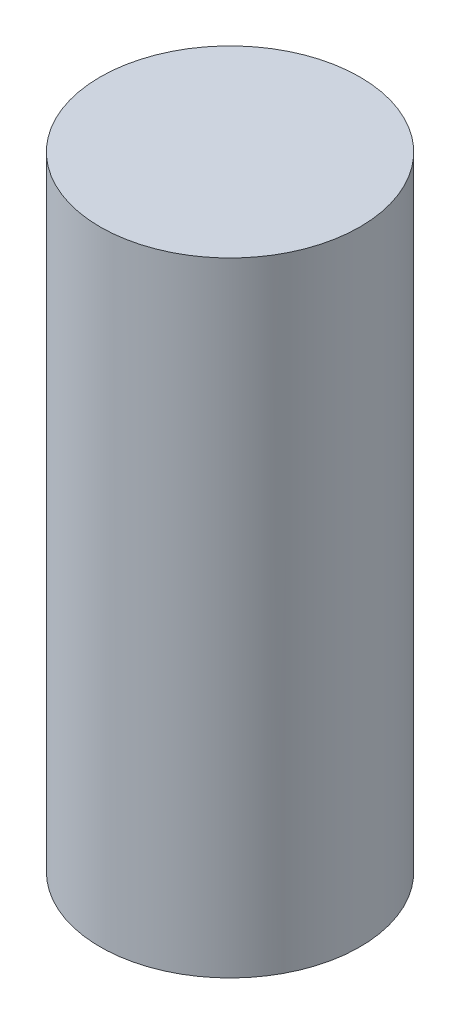
ISO-10303-21;
HEADER;
FILE_DESCRIPTION(('STEP AP214'),'2;1');
FILE_NAME('part.step','',(''),(''),'','','');
FILE_SCHEMA(('AUTOMOTIVE_DESIGN { 1 0 10303 214 1 1 1 1 }'));
ENDSEC;
DATA;
#1=APPLICATION_CONTEXT('core data for automotive mechanical design processes');
#2=APPLICATION_PROTOCOL_DEFINITION('international standard','automotive_design',2000,#1);
#3=PRODUCT_CONTEXT('',#1,'mechanical');
#4=PRODUCT('Part','Part','',(#3));
#5=PRODUCT_RELATED_PRODUCT_CATEGORY('part','',(#4));
#6=PRODUCT_DEFINITION_FORMATION('','',#4);
#7=PRODUCT_DEFINITION_CONTEXT('part definition',#1,'design');
#8=PRODUCT_DEFINITION('design','',#6,#7);
#9=PRODUCT_DEFINITION_SHAPE('','',#8);
#10=(LENGTH_UNIT() NAMED_UNIT(*) SI_UNIT(.MILLI.,.METRE.));
#11=(NAMED_UNIT(*) PLANE_ANGLE_UNIT() SI_UNIT($,.RADIAN.));
#12=(NAMED_UNIT(*) SI_UNIT($,.STERADIAN.) SOLID_ANGLE_UNIT());
#13=UNCERTAINTY_MEASURE_WITH_UNIT(LENGTH_MEASURE(1.E-05),#10,'distance_accuracy_value','');
#14=(GEOMETRIC_REPRESENTATION_CONTEXT(3) GLOBAL_UNCERTAINTY_ASSIGNED_CONTEXT((#13)) GLOBAL_UNIT_ASSIGNED_CONTEXT((#10,
#11,#12)) REPRESENTATION_CONTEXT('',''));
#15=CARTESIAN_POINT('',(0.,0.,0.));
#16=DIRECTION('',(0.,0.,1.));
#17=DIRECTION('',(1.,0.,0.));
#18=AXIS2_PLACEMENT_3D('',#15,#16,#17);
#19=CARTESIAN_POINT('',(-4.,40.,-11.));
#20=DIRECTION('',(-1.,0.,0.));
#21=DIRECTION('',(0.,0.,1.));
#22=AXIS2_PLACEMENT_3D('',#19,#20,#21);
#23=PLANE('',#22);
#24=DIRECTION('',(0.,0.,-1.));
#25=VECTOR('',#24,1.);
#26=CARTESIAN_POINT('',(-4.,0.,-11.));
#27=LINE('',#26,#25);
#28=CARTESIAN_POINT('',(-4.,0.,-11.));
#29=VERTEX_POINT('',#28);
#30=CARTESIAN_POINT('',(-4.,0.,-14.456832294801));
#31=VERTEX_POINT('',#30);
#32=EDGE_CURVE('E76',#29,#31,#27,.T.);
#33=ORIENTED_EDGE('',*,*,#32,.T.);
#34=DIRECTION('',(0.,-1.,0.));
#35=VECTOR('',#34,1.);
#36=CARTESIAN_POINT('',(-3.99999999999999,40.,-14.456832294801));
#37=LINE('',#36,#35);
#38=CARTESIAN_POINT('',(-3.99999999999999,40.,-14.456832294801));
#39=VERTEX_POINT('',#38);
#40=EDGE_CURVE('E11',#39,#31,#37,.T.);
#41=ORIENTED_EDGE('',*,*,#40,.F.);
#42=DIRECTION('',(0.,0.,-1.));
#43=VECTOR('',#42,1.);
#44=CARTESIAN_POINT('',(-4.,40.,-11.));
#45=LINE('',#44,#43);
#46=CARTESIAN_POINT('',(-4.,40.,-11.));
#47=VERTEX_POINT('',#46);
#48=EDGE_CURVE('E95',#47,#39,#45,.T.);
#49=ORIENTED_EDGE('',*,*,#48,.F.);
#50=DIRECTION('',(0.,-1.,0.));
#51=VECTOR('',#50,1.);
#52=CARTESIAN_POINT('',(-4.,40.,-11.));
#53=LINE('',#52,#51);
#54=EDGE_CURVE('E89',#47,#29,#53,.T.);
#55=ORIENTED_EDGE('',*,*,#54,.T.);
#56=EDGE_LOOP('',(#33,#41,#49,#55));
#57=FACE_BOUND('',#56,.T.);
#58=ADVANCED_FACE('F33',(#57),#23,.F.);
#59=CARTESIAN_POINT('',(0.,40.,0.));
#60=DIRECTION('',(0.,-1.,0.));
#61=DIRECTION('',(0.,0.,-1.));
#62=AXIS2_PLACEMENT_3D('',#59,#60,#61);
#63=CYLINDRICAL_SURFACE('',#62,15.);
#64=ORIENTED_EDGE('',*,*,#40,.T.);
#65=CARTESIAN_POINT('',(0.,0.,0.));
#66=DIRECTION('',(0.,-1.,0.));
#67=DIRECTION('',(0.,0.,-1.));
#68=AXIS2_PLACEMENT_3D('',#65,#66,#67);
#69=CIRCLE('',#68,15.);
#70=CARTESIAN_POINT('',(4.,0.,-14.456832294801));
#71=VERTEX_POINT('',#70);
#72=EDGE_CURVE('E72',#31,#71,#69,.T.);
#73=ORIENTED_EDGE('',*,*,#72,.T.);
#74=DIRECTION('',(0.,-1.,0.));
#75=VECTOR('',#74,1.);
#76=CARTESIAN_POINT('',(4.,40.,-14.456832294801));
#77=LINE('',#76,#75);
#78=CARTESIAN_POINT('',(4.,40.,-14.456832294801));
#79=VERTEX_POINT('',#78);
#80=EDGE_CURVE('E41',#79,#71,#77,.T.);
#81=ORIENTED_EDGE('',*,*,#80,.F.);
#82=CARTESIAN_POINT('',(0.,40.,0.));
#83=DIRECTION('',(0.,1.,0.));
#84=DIRECTION('',(0.,0.,1.));
#85=AXIS2_PLACEMENT_3D('',#82,#83,#84);
#86=CIRCLE('',#85,15.);
#87=EDGE_CURVE('E104',#79,#39,#86,.T.);
#88=ORIENTED_EDGE('',*,*,#87,.T.);
#89=EDGE_LOOP('',(#64,#73,#81,#88));
#90=FACE_BOUND('',#89,.T.);
#91=CARTESIAN_POINT('',(0.,52.,0.));
#92=DIRECTION('',(0.,1.,0.));
#93=DIRECTION('',(0.,0.,1.));
#94=AXIS2_PLACEMENT_3D('',#91,#92,#93);
#95=CIRCLE('',#94,15.);
#96=CARTESIAN_POINT('',(0.,52.,15.));
#97=VERTEX_POINT('',#96);
#98=EDGE_CURVE('E98',#97,#97,#95,.T.);
#99=ORIENTED_EDGE('',*,*,#98,.F.);
#100=EDGE_LOOP('',(#99));
#101=FACE_BOUND('',#100,.T.);
#102=CARTESIAN_POINT('',(0.,-20.,0.));
#103=DIRECTION('',(0.,-1.,0.));
#104=DIRECTION('',(0.,0.,-1.));
#105=AXIS2_PLACEMENT_3D('',#102,#103,#104);
#106=CIRCLE('',#105,15.);
#107=CARTESIAN_POINT('',(0.,-20.,-15.));
#108=VERTEX_POINT('',#107);
#109=EDGE_CURVE('E83',#108,#108,#106,.T.);
#110=ORIENTED_EDGE('',*,*,#109,.F.);
#111=EDGE_LOOP('',(#110));
#112=FACE_BOUND('',#111,.T.);
#113=ADVANCED_FACE('F79',(#90,#101,#112),#63,.T.);
#114=CARTESIAN_POINT('',(4.,40.,-11.));
#115=DIRECTION('',(1.,0.,0.));
#116=DIRECTION('',(0.,0.,-1.));
#117=AXIS2_PLACEMENT_3D('',#114,#115,#116);
#118=PLANE('',#117);
#119=DIRECTION('',(0.,0.,1.));
#120=VECTOR('',#119,1.);
#121=CARTESIAN_POINT('',(4.,0.,-11.));
#122=LINE('',#121,#120);
#123=CARTESIAN_POINT('',(4.,0.,-11.));
#124=VERTEX_POINT('',#123);
#125=EDGE_CURVE('E69',#71,#124,#122,.T.);
#126=ORIENTED_EDGE('',*,*,#125,.T.);
#127=DIRECTION('',(0.,-1.,0.));
#128=VECTOR('',#127,1.);
#129=CARTESIAN_POINT('',(4.,40.,-11.));
#130=LINE('',#129,#128);
#131=CARTESIAN_POINT('',(4.,40.,-11.));
#132=VERTEX_POINT('',#131);
#133=EDGE_CURVE('E48',#132,#124,#130,.T.);
#134=ORIENTED_EDGE('',*,*,#133,.F.);
#135=DIRECTION('',(0.,0.,1.));
#136=VECTOR('',#135,1.);
#137=CARTESIAN_POINT('',(4.,40.,-11.));
#138=LINE('',#137,#136);
#139=EDGE_CURVE('E87',#79,#132,#138,.T.);
#140=ORIENTED_EDGE('',*,*,#139,.F.);
#141=ORIENTED_EDGE('',*,*,#80,.T.);
#142=EDGE_LOOP('',(#126,#134,#140,#141));
#143=FACE_BOUND('',#142,.T.);
#144=ADVANCED_FACE('F85',(#143),#118,.F.);
#145=CARTESIAN_POINT('',(-4.,40.,-11.));
#146=DIRECTION('',(0.,0.,1.));
#147=DIRECTION('',(1.,0.,0.));
#148=AXIS2_PLACEMENT_3D('',#145,#146,#147);
#149=PLANE('',#148);
#150=DIRECTION('',(-1.,0.,0.));
#151=VECTOR('',#150,1.);
#152=CARTESIAN_POINT('',(-4.,0.,-11.));
#153=LINE('',#152,#151);
#154=EDGE_CURVE('E74',#124,#29,#153,.T.);
#155=ORIENTED_EDGE('',*,*,#154,.T.);
#156=ORIENTED_EDGE('',*,*,#54,.F.);
#157=DIRECTION('',(-1.,0.,0.));
#158=VECTOR('',#157,1.);
#159=CARTESIAN_POINT('',(-4.,40.,-11.));
#160=LINE('',#159,#158);
#161=EDGE_CURVE('E94',#132,#47,#160,.T.);
#162=ORIENTED_EDGE('',*,*,#161,.F.);
#163=ORIENTED_EDGE('',*,*,#133,.T.);
#164=EDGE_LOOP('',(#155,#156,#162,#163));
#165=FACE_BOUND('',#164,.T.);
#166=ADVANCED_FACE('F119',(#165),#149,.F.);
#167=CARTESIAN_POINT('',(0.,40.,0.));
#168=DIRECTION('',(0.,1.,0.));
#169=DIRECTION('',(0.,0.,1.));
#170=AXIS2_PLACEMENT_3D('',#167,#168,#169);
#171=PLANE('',#170);
#172=ORIENTED_EDGE('',*,*,#161,.T.);
#173=ORIENTED_EDGE('',*,*,#48,.T.);
#174=ORIENTED_EDGE('',*,*,#87,.F.);
#175=ORIENTED_EDGE('',*,*,#139,.T.);
#176=EDGE_LOOP('',(#172,#173,#174,#175));
#177=FACE_BOUND('',#176,.T.);
#178=ADVANCED_FACE('F126',(#177),#171,.F.);
#179=CARTESIAN_POINT('',(0.,52.,0.));
#180=DIRECTION('',(0.,1.,0.));
#181=DIRECTION('',(0.,0.,1.));
#182=AXIS2_PLACEMENT_3D('',#179,#180,#181);
#183=PLANE('',#182);
#184=ORIENTED_EDGE('',*,*,#98,.T.);
#185=EDGE_LOOP('',(#184));
#186=FACE_BOUND('',#185,.T.);
#187=ADVANCED_FACE('F130',(#186),#183,.T.);
#188=CARTESIAN_POINT('',(0.,-20.,0.));
#189=DIRECTION('',(0.,-1.,0.));
#190=DIRECTION('',(0.,0.,-1.));
#191=AXIS2_PLACEMENT_3D('',#188,#189,#190);
#192=PLANE('',#191);
#193=ORIENTED_EDGE('',*,*,#109,.T.);
#194=EDGE_LOOP('',(#193));
#195=FACE_BOUND('',#194,.T.);
#196=ADVANCED_FACE('F111',(#195),#192,.T.);
#197=CARTESIAN_POINT('',(0.,0.,0.));
#198=DIRECTION('',(0.,-1.,0.));
#199=DIRECTION('',(0.,0.,-1.));
#200=AXIS2_PLACEMENT_3D('',#197,#198,#199);
#201=PLANE('',#200);
#202=ORIENTED_EDGE('',*,*,#32,.F.);
#203=ORIENTED_EDGE('',*,*,#154,.F.);
#204=ORIENTED_EDGE('',*,*,#125,.F.);
#205=ORIENTED_EDGE('',*,*,#72,.F.);
#206=EDGE_LOOP('',(#202,#203,#204,#205));
#207=FACE_BOUND('',#206,.T.);
#208=ADVANCED_FACE('F71',(#207),#201,.F.);
#209=CLOSED_SHELL('',(#58,#113,#144,#166,#178,#187,#196,#208));
#210=MANIFOLD_SOLID_BREP('B2',#209);
#211=ADVANCED_BREP_SHAPE_REPRESENTATION('',(#18,#210),#14);
#212=SHAPE_DEFINITION_REPRESENTATION(#9,#211);
ENDSEC;
END-ISO-10303-21;
